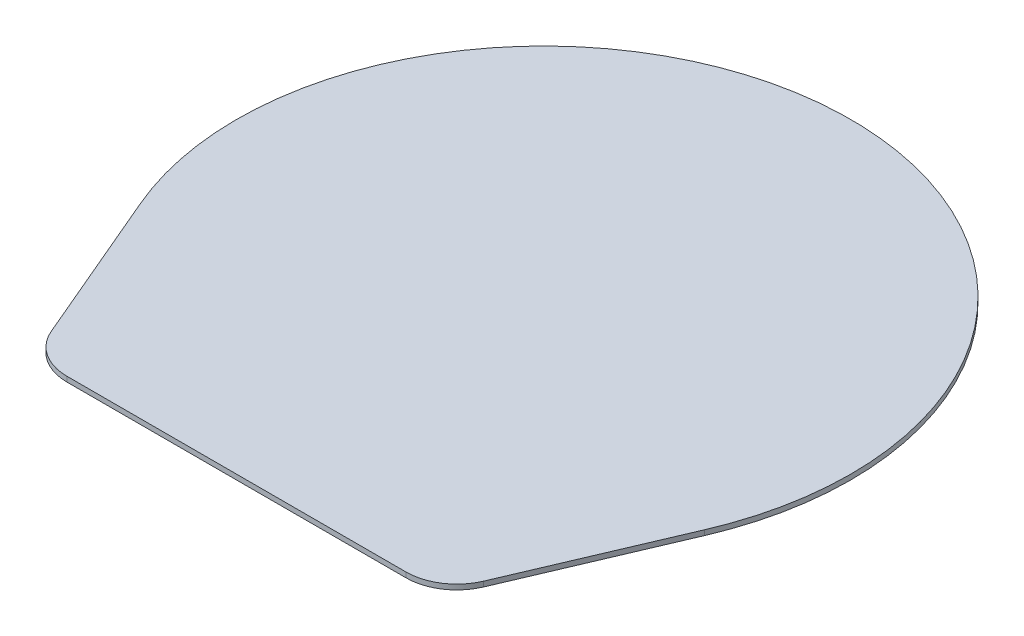
ISO-10303-21;
HEADER;
FILE_DESCRIPTION(('STEP AP214'),'2;1');
FILE_NAME('part.step','',(''),(''),'','','');
FILE_SCHEMA(('AUTOMOTIVE_DESIGN { 1 0 10303 214 1 1 1 1 }'));
ENDSEC;
DATA;
#1=APPLICATION_CONTEXT('core data for automotive mechanical design processes');
#2=APPLICATION_PROTOCOL_DEFINITION('international standard','automotive_design',2000,#1);
#3=PRODUCT_CONTEXT('',#1,'mechanical');
#4=PRODUCT('Part','Part','',(#3));
#5=PRODUCT_RELATED_PRODUCT_CATEGORY('part','',(#4));
#6=PRODUCT_DEFINITION_FORMATION('','',#4);
#7=PRODUCT_DEFINITION_CONTEXT('part definition',#1,'design');
#8=PRODUCT_DEFINITION('design','',#6,#7);
#9=PRODUCT_DEFINITION_SHAPE('','',#8);
#10=(LENGTH_UNIT() NAMED_UNIT(*) SI_UNIT(.MILLI.,.METRE.));
#11=(NAMED_UNIT(*) PLANE_ANGLE_UNIT() SI_UNIT($,.RADIAN.));
#12=(NAMED_UNIT(*) SI_UNIT($,.STERADIAN.) SOLID_ANGLE_UNIT());
#13=UNCERTAINTY_MEASURE_WITH_UNIT(LENGTH_MEASURE(1.E-05),#10,'distance_accuracy_value','');
#14=(GEOMETRIC_REPRESENTATION_CONTEXT(3) GLOBAL_UNCERTAINTY_ASSIGNED_CONTEXT((#13)) GLOBAL_UNIT_ASSIGNED_CONTEXT((#10,
#11,#12)) REPRESENTATION_CONTEXT('',''));
#15=CARTESIAN_POINT('',(0.,0.,0.));
#16=DIRECTION('',(0.,0.,1.));
#17=DIRECTION('',(1.,0.,0.));
#18=AXIS2_PLACEMENT_3D('',#15,#16,#17);
#19=CARTESIAN_POINT('',(0.,1.,0.));
#20=DIRECTION('',(0.,-1.,0.));
#21=DIRECTION('',(0.,0.,-1.));
#22=AXIS2_PLACEMENT_3D('',#19,#20,#21);
#23=CYLINDRICAL_SURFACE('',#22,60.5);
#24=DIRECTION('',(0.,1.,0.));
#25=VECTOR('',#24,1.);
#26=CARTESIAN_POINT('',(55.5773109072326,0.,23.9042362839895));
#27=LINE('',#26,#25);
#28=CARTESIAN_POINT('',(55.5773109072326,0.,23.9042362839895));
#29=VERTEX_POINT('',#28);
#30=CARTESIAN_POINT('',(55.5773109072326,1.,23.9042362839895));
#31=VERTEX_POINT('',#30);
#32=EDGE_CURVE('E109',#29,#31,#27,.T.);
#33=ORIENTED_EDGE('',*,*,#32,.F.);
#34=CARTESIAN_POINT('',(0.,0.,0.));
#35=DIRECTION('',(0.,1.,0.));
#36=DIRECTION('',(0.,0.,1.));
#37=AXIS2_PLACEMENT_3D('',#34,#35,#36);
#38=CIRCLE('',#37,60.5);
#39=CARTESIAN_POINT('',(-55.5773109072341,0.,23.9042362839861));
#40=VERTEX_POINT('',#39);
#41=EDGE_CURVE('E130',#29,#40,#38,.T.);
#42=ORIENTED_EDGE('',*,*,#41,.T.);
#43=DIRECTION('',(0.,1.,0.));
#44=VECTOR('',#43,1.);
#45=CARTESIAN_POINT('',(-55.5773109072334,0.,23.9042362839878));
#46=LINE('',#45,#44);
#47=CARTESIAN_POINT('',(-55.5773109072341,1.,23.9042362839861));
#48=VERTEX_POINT('',#47);
#49=EDGE_CURVE('E127',#40,#48,#46,.T.);
#50=ORIENTED_EDGE('',*,*,#49,.T.);
#51=CARTESIAN_POINT('',(0.,1.,0.));
#52=DIRECTION('',(0.,1.,0.));
#53=DIRECTION('',(0.,0.,1.));
#54=AXIS2_PLACEMENT_3D('',#51,#52,#53);
#55=CIRCLE('',#54,60.5);
#56=EDGE_CURVE('E122',#31,#48,#55,.T.);
#57=ORIENTED_EDGE('',*,*,#56,.F.);
#58=EDGE_LOOP('',(#33,#42,#50,#57));
#59=FACE_BOUND('',#58,.T.);
#60=ADVANCED_FACE('F55',(#59),#23,.T.);
#61=CARTESIAN_POINT('',(0.,1.,0.));
#62=DIRECTION('',(0.,1.,0.));
#63=DIRECTION('',(0.,0.,1.));
#64=AXIS2_PLACEMENT_3D('',#61,#62,#63);
#65=PLANE('',#64);
#66=DIRECTION('',(1.,0.,0.));
#67=VECTOR('',#66,1.);
#68=CARTESIAN_POINT('',(0.,1.,60.5));
#69=LINE('',#68,#67);
#70=CARTESIAN_POINT('',(-33.3883529070838,1.,60.5));
#71=VERTEX_POINT('',#70);
#72=CARTESIAN_POINT('',(33.3883529070838,1.,60.5));
#73=VERTEX_POINT('',#72);
#74=EDGE_CURVE('E244',#71,#73,#69,.T.);
#75=ORIENTED_EDGE('',*,*,#74,.T.);
#76=CARTESIAN_POINT('',(33.3883529070838,1.,50.5));
#77=DIRECTION('',(0.,1.,0.));
#78=DIRECTION('',(0.,0.,1.));
#79=AXIS2_PLACEMENT_3D('',#76,#77,#78);
#80=CIRCLE('',#79,10.);
#81=CARTESIAN_POINT('',(42.5894783905698,1.,54.4165405445553));
#82=VERTEX_POINT('',#81);
#83=EDGE_CURVE('E124',#73,#82,#80,.T.);
#84=ORIENTED_EDGE('',*,*,#83,.T.);
#85=DIRECTION('',(-0.391654054455532,0.,0.920112548348594));
#86=VECTOR('',#85,1.);
#87=CARTESIAN_POINT('',(55.6664155771681,1.,23.6949027561187));
#88=LINE('',#87,#86);
#89=EDGE_CURVE('E112',#31,#82,#88,.T.);
#90=ORIENTED_EDGE('',*,*,#89,.F.);
#91=ORIENTED_EDGE('',*,*,#56,.T.);
#92=DIRECTION('',(0.391654054455532,0.,0.920112548348594));
#93=VECTOR('',#92,1.);
#94=CARTESIAN_POINT('',(-55.6664155771681,1.,23.6949027561187));
#95=LINE('',#94,#93);
#96=CARTESIAN_POINT('',(-42.5894783905698,1.,54.4165405445553));
#97=VERTEX_POINT('',#96);
#98=EDGE_CURVE('E246',#48,#97,#95,.T.);
#99=ORIENTED_EDGE('',*,*,#98,.T.);
#100=CARTESIAN_POINT('',(-33.3883529070838,1.,50.5));
#101=DIRECTION('',(0.,1.,0.));
#102=DIRECTION('',(0.,0.,1.));
#103=AXIS2_PLACEMENT_3D('',#100,#101,#102);
#104=CIRCLE('',#103,10.);
#105=EDGE_CURVE('E140',#97,#71,#104,.T.);
#106=ORIENTED_EDGE('',*,*,#105,.T.);
#107=EDGE_LOOP('',(#75,#84,#90,#91,#99,#106));
#108=FACE_BOUND('',#107,.T.);
#109=ADVANCED_FACE('F120',(#108),#65,.T.);
#110=CARTESIAN_POINT('',(0.,0.,0.));
#111=DIRECTION('',(0.,1.,0.));
#112=DIRECTION('',(0.,0.,1.));
#113=AXIS2_PLACEMENT_3D('',#110,#111,#112);
#114=PLANE('',#113);
#115=DIRECTION('',(-0.391654054455532,0.,0.920112548348594));
#116=VECTOR('',#115,1.);
#117=CARTESIAN_POINT('',(55.6664155771681,0.,23.6949027561187));
#118=LINE('',#117,#116);
#119=CARTESIAN_POINT('',(42.5894783905698,0.,54.4165405445553));
#120=VERTEX_POINT('',#119);
#121=EDGE_CURVE('E113',#29,#120,#118,.T.);
#122=ORIENTED_EDGE('',*,*,#121,.T.);
#123=CARTESIAN_POINT('',(33.3883529070838,0.,50.5));
#124=DIRECTION('',(0.,1.,0.));
#125=DIRECTION('',(0.,0.,1.));
#126=AXIS2_PLACEMENT_3D('',#123,#124,#125);
#127=CIRCLE('',#126,10.);
#128=CARTESIAN_POINT('',(33.3883529070838,0.,60.5));
#129=VERTEX_POINT('',#128);
#130=EDGE_CURVE('E63',#120,#129,#127,.F.);
#131=ORIENTED_EDGE('',*,*,#130,.T.);
#132=DIRECTION('',(1.,0.,0.));
#133=VECTOR('',#132,1.);
#134=CARTESIAN_POINT('',(0.,0.,60.5));
#135=LINE('',#134,#133);
#136=CARTESIAN_POINT('',(-33.3883529070838,0.,60.5));
#137=VERTEX_POINT('',#136);
#138=EDGE_CURVE('E147',#137,#129,#135,.T.);
#139=ORIENTED_EDGE('',*,*,#138,.F.);
#140=CARTESIAN_POINT('',(-33.3883529070838,0.,50.5));
#141=DIRECTION('',(0.,1.,0.));
#142=DIRECTION('',(0.,0.,1.));
#143=AXIS2_PLACEMENT_3D('',#140,#141,#142);
#144=CIRCLE('',#143,10.);
#145=CARTESIAN_POINT('',(-42.5894783905698,0.,54.4165405445553));
#146=VERTEX_POINT('',#145);
#147=EDGE_CURVE('E70',#137,#146,#144,.F.);
#148=ORIENTED_EDGE('',*,*,#147,.T.);
#149=DIRECTION('',(0.391654054455532,0.,0.920112548348594));
#150=VECTOR('',#149,1.);
#151=CARTESIAN_POINT('',(-55.6664155771681,0.,23.6949027561187));
#152=LINE('',#151,#150);
#153=EDGE_CURVE('E154',#40,#146,#152,.T.);
#154=ORIENTED_EDGE('',*,*,#153,.F.);
#155=ORIENTED_EDGE('',*,*,#41,.F.);
#156=EDGE_LOOP('',(#122,#131,#139,#148,#154,#155));
#157=FACE_BOUND('',#156,.T.);
#158=ADVANCED_FACE('F146',(#157),#114,.F.);
#159=CARTESIAN_POINT('',(0.,0.,60.5));
#160=DIRECTION('',(0.,0.,1.));
#161=DIRECTION('',(1.,0.,0.));
#162=AXIS2_PLACEMENT_3D('',#159,#160,#161);
#163=PLANE('',#162);
#164=ORIENTED_EDGE('',*,*,#138,.T.);
#165=DIRECTION('',(0.,1.,0.));
#166=VECTOR('',#165,1.);
#167=CARTESIAN_POINT('',(33.3883529070838,1.,60.5));
#168=LINE('',#167,#166);
#169=EDGE_CURVE('E132',#129,#73,#168,.T.);
#170=ORIENTED_EDGE('',*,*,#169,.T.);
#171=ORIENTED_EDGE('',*,*,#74,.F.);
#172=DIRECTION('',(0.,1.,0.));
#173=VECTOR('',#172,1.);
#174=CARTESIAN_POINT('',(-33.3883529070838,0.,60.5));
#175=LINE('',#174,#173);
#176=EDGE_CURVE('E129',#71,#137,#175,.F.);
#177=ORIENTED_EDGE('',*,*,#176,.T.);
#178=EDGE_LOOP('',(#164,#170,#171,#177));
#179=FACE_BOUND('',#178,.T.);
#180=ADVANCED_FACE('F151',(#179),#163,.T.);
#181=CARTESIAN_POINT('',(-55.6664155771681,0.,23.6949027561187));
#182=DIRECTION('',(-0.920112548348594,0.,0.391654054455532));
#183=DIRECTION('',(0.391654054455532,0.,0.920112548348594));
#184=AXIS2_PLACEMENT_3D('',#181,#182,#183);
#185=PLANE('',#184);
#186=ORIENTED_EDGE('',*,*,#153,.T.);
#187=DIRECTION('',(0.,1.,0.));
#188=VECTOR('',#187,1.);
#189=CARTESIAN_POINT('',(-42.5894783905698,0.,54.4165405445553));
#190=LINE('',#189,#188);
#191=EDGE_CURVE('E12',#146,#97,#190,.T.);
#192=ORIENTED_EDGE('',*,*,#191,.T.);
#193=ORIENTED_EDGE('',*,*,#98,.F.);
#194=ORIENTED_EDGE('',*,*,#49,.F.);
#195=EDGE_LOOP('',(#186,#192,#193,#194));
#196=FACE_BOUND('',#195,.T.);
#197=ADVANCED_FACE('F163',(#196),#185,.T.);
#198=CARTESIAN_POINT('',(55.6664155771681,0.,23.6949027561187));
#199=DIRECTION('',(-0.920112548348594,0.,-0.391654054455532));
#200=DIRECTION('',(-0.391654054455532,0.,0.920112548348594));
#201=AXIS2_PLACEMENT_3D('',#198,#199,#200);
#202=PLANE('',#201);
#203=ORIENTED_EDGE('',*,*,#89,.T.);
#204=DIRECTION('',(0.,1.,0.));
#205=VECTOR('',#204,1.);
#206=CARTESIAN_POINT('',(42.5894783905698,0.,54.4165405445553));
#207=LINE('',#206,#205);
#208=EDGE_CURVE('E78',#82,#120,#207,.F.);
#209=ORIENTED_EDGE('',*,*,#208,.T.);
#210=ORIENTED_EDGE('',*,*,#121,.F.);
#211=ORIENTED_EDGE('',*,*,#32,.T.);
#212=EDGE_LOOP('',(#203,#209,#210,#211));
#213=FACE_BOUND('',#212,.T.);
#214=ADVANCED_FACE('F111',(#213),#202,.F.);
#215=CARTESIAN_POINT('',(33.3883529070838,0.,50.5));
#216=DIRECTION('',(0.,-1.,0.));
#217=DIRECTION('',(0.,0.,-1.));
#218=AXIS2_PLACEMENT_3D('',#215,#216,#217);
#219=CYLINDRICAL_SURFACE('',#218,10.);
#220=ORIENTED_EDGE('',*,*,#130,.F.);
#221=ORIENTED_EDGE('',*,*,#208,.F.);
#222=ORIENTED_EDGE('',*,*,#83,.F.);
#223=ORIENTED_EDGE('',*,*,#169,.F.);
#224=EDGE_LOOP('',(#220,#221,#222,#223));
#225=FACE_BOUND('',#224,.T.);
#226=ADVANCED_FACE('F156',(#225),#219,.T.);
#227=CARTESIAN_POINT('',(-33.3883529070838,0.,50.5));
#228=DIRECTION('',(0.,1.,0.));
#229=DIRECTION('',(0.,0.,1.));
#230=AXIS2_PLACEMENT_3D('',#227,#228,#229);
#231=CYLINDRICAL_SURFACE('',#230,10.);
#232=ORIENTED_EDGE('',*,*,#147,.F.);
#233=ORIENTED_EDGE('',*,*,#176,.F.);
#234=ORIENTED_EDGE('',*,*,#105,.F.);
#235=ORIENTED_EDGE('',*,*,#191,.F.);
#236=EDGE_LOOP('',(#232,#233,#234,#235));
#237=FACE_BOUND('',#236,.T.);
#238=ADVANCED_FACE('F57',(#237),#231,.T.);
#239=CLOSED_SHELL('',(#60,#109,#158,#180,#197,#214,#226,#238));
#240=MANIFOLD_SOLID_BREP('B2',#239);
#241=ADVANCED_BREP_SHAPE_REPRESENTATION('',(#18,#240),#14);
#242=SHAPE_DEFINITION_REPRESENTATION(#9,#241);
ENDSEC;
END-ISO-10303-21;
